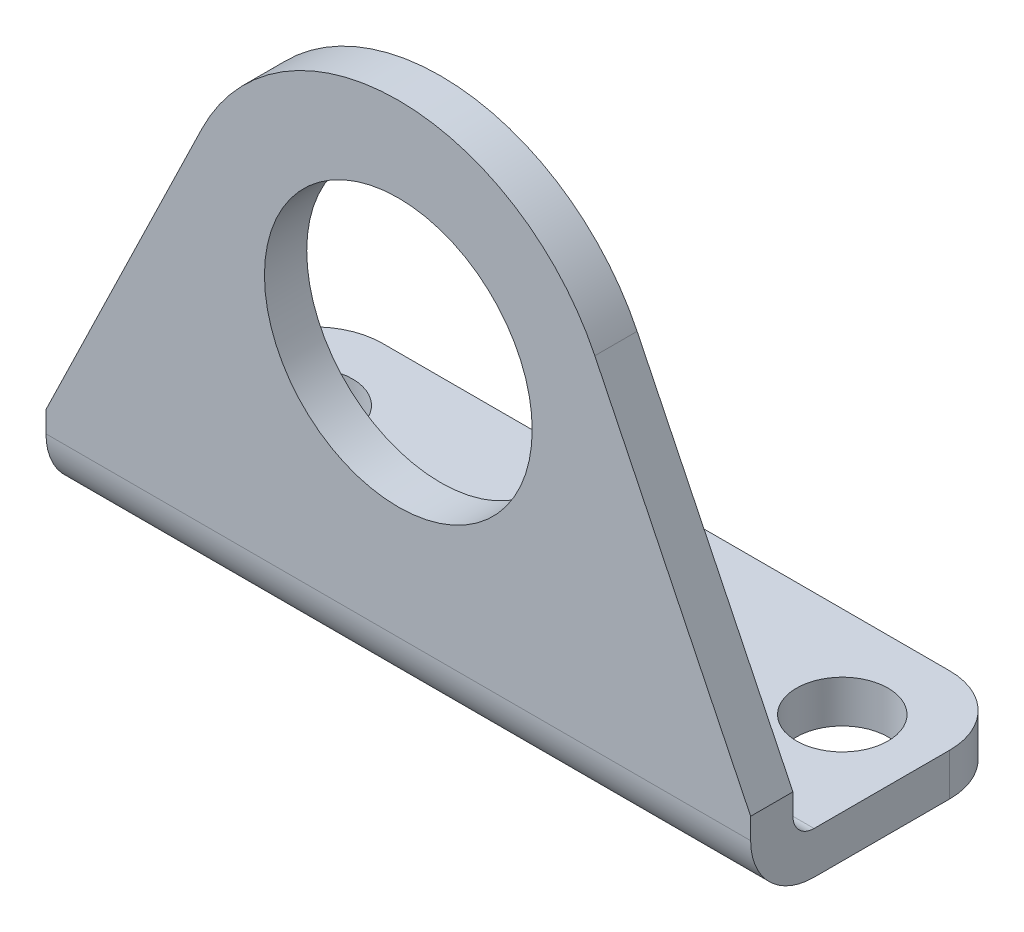
ISO-10303-21;
HEADER;
FILE_DESCRIPTION(('STEP AP214'),'2;1');
FILE_NAME('part.step','',(''),(''),'','','');
FILE_SCHEMA(('AUTOMOTIVE_DESIGN { 1 0 10303 214 1 1 1 1 }'));
ENDSEC;
DATA;
#1=APPLICATION_CONTEXT('core data for automotive mechanical design processes');
#2=APPLICATION_PROTOCOL_DEFINITION('international standard','automotive_design',2000,#1);
#3=PRODUCT_CONTEXT('',#1,'mechanical');
#4=PRODUCT('Part','Part','',(#3));
#5=PRODUCT_RELATED_PRODUCT_CATEGORY('part','',(#4));
#6=PRODUCT_DEFINITION_FORMATION('','',#4);
#7=PRODUCT_DEFINITION_CONTEXT('part definition',#1,'design');
#8=PRODUCT_DEFINITION('design','',#6,#7);
#9=PRODUCT_DEFINITION_SHAPE('','',#8);
#10=(LENGTH_UNIT() NAMED_UNIT(*) SI_UNIT(.MILLI.,.METRE.));
#11=(NAMED_UNIT(*) PLANE_ANGLE_UNIT() SI_UNIT($,.RADIAN.));
#12=(NAMED_UNIT(*) SI_UNIT($,.STERADIAN.) SOLID_ANGLE_UNIT());
#13=UNCERTAINTY_MEASURE_WITH_UNIT(LENGTH_MEASURE(1.E-05),#10,'distance_accuracy_value','');
#14=(GEOMETRIC_REPRESENTATION_CONTEXT(3) GLOBAL_UNCERTAINTY_ASSIGNED_CONTEXT((#13)) GLOBAL_UNIT_ASSIGNED_CONTEXT((#10,
#11,#12)) REPRESENTATION_CONTEXT('',''));
#15=CARTESIAN_POINT('',(0.,0.,0.));
#16=DIRECTION('',(0.,0.,1.));
#17=DIRECTION('',(1.,0.,0.));
#18=AXIS2_PLACEMENT_3D('',#15,#16,#17);
#19=CARTESIAN_POINT('',(-12.7,0.,6.35));
#20=DIRECTION('',(0.,1.,0.));
#21=DIRECTION('',(0.,0.,1.));
#22=AXIS2_PLACEMENT_3D('',#19,#20,#21);
#23=PLANE('',#22);
#24=CARTESIAN_POINT('',(-9.652,0.,0.));
#25=DIRECTION('',(0.,1.,0.));
#26=DIRECTION('',(0.,0.,1.));
#27=AXIS2_PLACEMENT_3D('',#24,#25,#26);
#28=CIRCLE('',#27,1.651);
#29=CARTESIAN_POINT('',(-9.652,0.,1.651));
#30=VERTEX_POINT('',#29);
#31=EDGE_CURVE('E223',#30,#30,#28,.T.);
#32=ORIENTED_EDGE('',*,*,#31,.T.);
#33=EDGE_LOOP('',(#32));
#34=FACE_BOUND('',#33,.T.);
#35=CARTESIAN_POINT('',(9.652,0.,0.));
#36=DIRECTION('',(0.,1.,0.));
#37=DIRECTION('',(0.,0.,1.));
#38=AXIS2_PLACEMENT_3D('',#35,#36,#37);
#39=CIRCLE('',#38,1.65099999999999);
#40=CARTESIAN_POINT('',(9.652,0.,1.65099999999999));
#41=VERTEX_POINT('',#40);
#42=EDGE_CURVE('E219',#41,#41,#39,.T.);
#43=ORIENTED_EDGE('',*,*,#42,.T.);
#44=EDGE_LOOP('',(#43));
#45=FACE_BOUND('',#44,.T.);
#46=DIRECTION('',(0.,0.,-1.));
#47=VECTOR('',#46,1.);
#48=CARTESIAN_POINT('',(-12.7,0.,6.35));
#49=LINE('',#48,#47);
#50=CARTESIAN_POINT('',(-12.7,0.,4.064));
#51=VERTEX_POINT('',#50);
#52=CARTESIAN_POINT('',(-12.7,0.,-0.8255));
#53=VERTEX_POINT('',#52);
#54=EDGE_CURVE('E173',#51,#53,#49,.T.);
#55=ORIENTED_EDGE('',*,*,#54,.T.);
#56=CARTESIAN_POINT('',(-10.2235,0.,-0.8255));
#57=DIRECTION('',(0.,1.,0.));
#58=DIRECTION('',(0.,0.,1.));
#59=AXIS2_PLACEMENT_3D('',#56,#57,#58);
#60=CIRCLE('',#59,2.4765);
#61=CARTESIAN_POINT('',(-10.2235,0.,-3.302));
#62=VERTEX_POINT('',#61);
#63=EDGE_CURVE('E190',#53,#62,#60,.F.);
#64=ORIENTED_EDGE('',*,*,#63,.T.);
#65=DIRECTION('',(1.,0.,0.));
#66=VECTOR('',#65,1.);
#67=CARTESIAN_POINT('',(-12.7,0.,-3.302));
#68=LINE('',#67,#66);
#69=CARTESIAN_POINT('',(10.2235,0.,-3.302));
#70=VERTEX_POINT('',#69);
#71=EDGE_CURVE('E216',#62,#70,#68,.T.);
#72=ORIENTED_EDGE('',*,*,#71,.T.);
#73=CARTESIAN_POINT('',(10.2235,0.,-0.8255));
#74=DIRECTION('',(0.,1.,0.));
#75=DIRECTION('',(0.,0.,1.));
#76=AXIS2_PLACEMENT_3D('',#73,#74,#75);
#77=CIRCLE('',#76,2.4765);
#78=CARTESIAN_POINT('',(12.7,0.,-0.8255));
#79=VERTEX_POINT('',#78);
#80=EDGE_CURVE('E188',#70,#79,#77,.F.);
#81=ORIENTED_EDGE('',*,*,#80,.T.);
#82=DIRECTION('',(0.,0.,-1.));
#83=VECTOR('',#82,1.);
#84=CARTESIAN_POINT('',(12.7,0.,6.35));
#85=LINE('',#84,#83);
#86=CARTESIAN_POINT('',(12.7,0.,4.064));
#87=VERTEX_POINT('',#86);
#88=EDGE_CURVE('E171',#87,#79,#85,.T.);
#89=ORIENTED_EDGE('',*,*,#88,.F.);
#90=DIRECTION('',(-1.,0.,0.));
#91=VECTOR('',#90,1.);
#92=CARTESIAN_POINT('',(12.7,0.,4.064));
#93=LINE('',#92,#91);
#94=EDGE_CURVE('E130',#87,#51,#93,.T.);
#95=ORIENTED_EDGE('',*,*,#94,.T.);
#96=EDGE_LOOP('',(#55,#64,#72,#81,#89,#95));
#97=FACE_BOUND('',#96,.T.);
#98=ADVANCED_FACE('F34',(#34,#45,#97),#23,.F.);
#99=CARTESIAN_POINT('',(0.,11.176,6.35));
#100=DIRECTION('',(0.,0.,1.));
#101=DIRECTION('',(1.,0.,0.));
#102=AXIS2_PLACEMENT_3D('',#99,#100,#101);
#103=PLANE('',#102);
#104=CARTESIAN_POINT('',(0.,11.176,6.35));
#105=DIRECTION('',(0.,0.,1.));
#106=DIRECTION('',(1.,0.,0.));
#107=AXIS2_PLACEMENT_3D('',#104,#105,#106);
#108=CIRCLE('',#107,4.826);
#109=CARTESIAN_POINT('',(4.826,11.176,6.35));
#110=VERTEX_POINT('',#109);
#111=EDGE_CURVE('E154',#110,#110,#108,.T.);
#112=ORIENTED_EDGE('',*,*,#111,.F.);
#113=EDGE_LOOP('',(#112));
#114=FACE_BOUND('',#113,.T.);
#115=DIRECTION('',(0.,-1.,0.));
#116=VECTOR('',#115,1.);
#117=CARTESIAN_POINT('',(-12.7,3.048,6.35));
#118=LINE('',#117,#116);
#119=CARTESIAN_POINT('',(-12.7,3.048,6.35));
#120=VERTEX_POINT('',#119);
#121=CARTESIAN_POINT('',(-12.7,2.286,6.35));
#122=VERTEX_POINT('',#121);
#123=EDGE_CURVE('E143',#120,#122,#118,.T.);
#124=ORIENTED_EDGE('',*,*,#123,.T.);
#125=DIRECTION('',(-1.,0.,0.));
#126=VECTOR('',#125,1.);
#127=CARTESIAN_POINT('',(12.7,2.286,6.35));
#128=LINE('',#127,#126);
#129=CARTESIAN_POINT('',(12.7,2.286,6.35));
#130=VERTEX_POINT('',#129);
#131=EDGE_CURVE('E127',#130,#122,#128,.T.);
#132=ORIENTED_EDGE('',*,*,#131,.F.);
#133=DIRECTION('',(0.,1.,0.));
#134=VECTOR('',#133,1.);
#135=CARTESIAN_POINT('',(12.7,0.,6.35));
#136=LINE('',#135,#134);
#137=CARTESIAN_POINT('',(12.7,3.048,6.35));
#138=VERTEX_POINT('',#137);
#139=EDGE_CURVE('E140',#130,#138,#136,.T.);
#140=ORIENTED_EDGE('',*,*,#139,.T.);
#141=DIRECTION('',(-0.436805905723447,0.899555779663006,0.));
#142=VECTOR('',#141,1.);
#143=CARTESIAN_POINT('',(12.7,3.048,6.35));
#144=LINE('',#143,#142);
#145=CARTESIAN_POINT('',(7.08310220906652,14.6154097016664,6.35));
#146=VERTEX_POINT('',#145);
#147=EDGE_CURVE('E150',#138,#146,#144,.T.);
#148=ORIENTED_EDGE('',*,*,#147,.T.);
#149=CARTESIAN_POINT('',(0.,11.176,6.35));
#150=DIRECTION('',(0.,0.,1.));
#151=DIRECTION('',(1.,0.,0.));
#152=AXIS2_PLACEMENT_3D('',#149,#150,#151);
#153=CIRCLE('',#152,7.87400000000001);
#154=CARTESIAN_POINT('',(-7.08310220906651,14.6154097016664,6.35));
#155=VERTEX_POINT('',#154);
#156=EDGE_CURVE('E152',#146,#155,#153,.T.);
#157=ORIENTED_EDGE('',*,*,#156,.T.);
#158=DIRECTION('',(-0.436805905723447,-0.899555779663006,0.));
#159=VECTOR('',#158,1.);
#160=CARTESIAN_POINT('',(-7.08310220906651,14.6154097016664,6.35));
#161=LINE('',#160,#159);
#162=EDGE_CURVE('E159',#155,#120,#161,.T.);
#163=ORIENTED_EDGE('',*,*,#162,.T.);
#164=EDGE_LOOP('',(#124,#132,#140,#148,#157,#163));
#165=FACE_BOUND('',#164,.T.);
#166=ADVANCED_FACE('F139',(#114,#165),#103,.T.);
#167=CARTESIAN_POINT('',(-7.08310220906651,14.6154097016664,6.35));
#168=DIRECTION('',(0.899555779663006,-0.436805905723447,0.));
#169=DIRECTION('',(0.436805905723447,0.899555779663006,0.));
#170=AXIS2_PLACEMENT_3D('',#167,#168,#169);
#171=PLANE('',#170);
#172=DIRECTION('',(0.,0.,-1.));
#173=VECTOR('',#172,1.);
#174=CARTESIAN_POINT('',(-7.08310220906651,14.6154097016664,6.35));
#175=LINE('',#174,#173);
#176=CARTESIAN_POINT('',(-7.08310220906651,14.6154097016664,4.826));
#177=VERTEX_POINT('',#176);
#178=EDGE_CURVE('E164',#155,#177,#175,.T.);
#179=ORIENTED_EDGE('',*,*,#178,.T.);
#180=DIRECTION('',(-0.436805905723447,-0.899555779663006,0.));
#181=VECTOR('',#180,1.);
#182=CARTESIAN_POINT('',(-7.08310220906651,14.6154097016664,4.826));
#183=LINE('',#182,#181);
#184=CARTESIAN_POINT('',(-12.7,3.048,4.826));
#185=VERTEX_POINT('',#184);
#186=EDGE_CURVE('E228',#177,#185,#183,.T.);
#187=ORIENTED_EDGE('',*,*,#186,.T.);
#188=DIRECTION('',(0.,0.,-1.));
#189=VECTOR('',#188,1.);
#190=CARTESIAN_POINT('',(-12.7,3.048,6.35));
#191=LINE('',#190,#189);
#192=EDGE_CURVE('E161',#120,#185,#191,.T.);
#193=ORIENTED_EDGE('',*,*,#192,.F.);
#194=ORIENTED_EDGE('',*,*,#162,.F.);
#195=EDGE_LOOP('',(#179,#187,#193,#194));
#196=FACE_BOUND('',#195,.T.);
#197=ADVANCED_FACE('F264',(#196),#171,.F.);
#198=CARTESIAN_POINT('',(12.7,3.048,6.35));
#199=DIRECTION('',(-0.899555779663006,-0.436805905723447,0.));
#200=DIRECTION('',(0.436805905723447,-0.899555779663006,0.));
#201=AXIS2_PLACEMENT_3D('',#198,#199,#200);
#202=PLANE('',#201);
#203=DIRECTION('',(0.,0.,-1.));
#204=VECTOR('',#203,1.);
#205=CARTESIAN_POINT('',(12.7,3.048,6.35));
#206=LINE('',#205,#204);
#207=CARTESIAN_POINT('',(12.7,3.048,4.826));
#208=VERTEX_POINT('',#207);
#209=EDGE_CURVE('E148',#138,#208,#206,.T.);
#210=ORIENTED_EDGE('',*,*,#209,.T.);
#211=DIRECTION('',(-0.436805905723447,0.899555779663006,0.));
#212=VECTOR('',#211,1.);
#213=CARTESIAN_POINT('',(12.7,3.048,4.826));
#214=LINE('',#213,#212);
#215=CARTESIAN_POINT('',(7.08310220906652,14.6154097016664,4.826));
#216=VERTEX_POINT('',#215);
#217=EDGE_CURVE('E231',#208,#216,#214,.T.);
#218=ORIENTED_EDGE('',*,*,#217,.T.);
#219=DIRECTION('',(0.,0.,-1.));
#220=VECTOR('',#219,1.);
#221=CARTESIAN_POINT('',(7.08310220906652,14.6154097016664,6.35));
#222=LINE('',#221,#220);
#223=EDGE_CURVE('E167',#146,#216,#222,.T.);
#224=ORIENTED_EDGE('',*,*,#223,.F.);
#225=ORIENTED_EDGE('',*,*,#147,.F.);
#226=EDGE_LOOP('',(#210,#218,#224,#225));
#227=FACE_BOUND('',#226,.T.);
#228=ADVANCED_FACE('F272',(#227),#202,.F.);
#229=CARTESIAN_POINT('',(-12.7,3.048,6.35));
#230=DIRECTION('',(1.,0.,0.));
#231=DIRECTION('',(0.,0.,-1.));
#232=AXIS2_PLACEMENT_3D('',#229,#230,#231);
#233=PLANE('',#232);
#234=DIRECTION('',(0.,0.,1.));
#235=VECTOR('',#234,1.);
#236=CARTESIAN_POINT('',(-12.7,1.524,-3.302));
#237=LINE('',#236,#235);
#238=CARTESIAN_POINT('',(-12.7,1.524,-0.8255));
#239=VERTEX_POINT('',#238);
#240=CARTESIAN_POINT('',(-12.7,1.524,4.064));
#241=VERTEX_POINT('',#240);
#242=EDGE_CURVE('E200',#239,#241,#237,.T.);
#243=ORIENTED_EDGE('',*,*,#242,.F.);
#244=DIRECTION('',(0.,-1.,0.));
#245=VECTOR('',#244,1.);
#246=CARTESIAN_POINT('',(-12.7,3.048,-0.8255));
#247=LINE('',#246,#245);
#248=EDGE_CURVE('E176',#239,#53,#247,.T.);
#249=ORIENTED_EDGE('',*,*,#248,.T.);
#250=ORIENTED_EDGE('',*,*,#54,.F.);
#251=CARTESIAN_POINT('',(-12.7,2.286,4.064));
#252=DIRECTION('',(1.,0.,0.));
#253=DIRECTION('',(0.,0.,1.));
#254=AXIS2_PLACEMENT_3D('',#251,#252,#253);
#255=CIRCLE('',#254,2.286);
#256=EDGE_CURVE('E135',#122,#51,#255,.T.);
#257=ORIENTED_EDGE('',*,*,#256,.F.);
#258=ORIENTED_EDGE('',*,*,#123,.F.);
#259=ORIENTED_EDGE('',*,*,#192,.T.);
#260=DIRECTION('',(0.,1.,0.));
#261=VECTOR('',#260,1.);
#262=CARTESIAN_POINT('',(-12.7,19.05,4.826));
#263=LINE('',#262,#261);
#264=CARTESIAN_POINT('',(-12.7,2.286,4.826));
#265=VERTEX_POINT('',#264);
#266=EDGE_CURVE('E243',#265,#185,#263,.T.);
#267=ORIENTED_EDGE('',*,*,#266,.F.);
#268=CARTESIAN_POINT('',(-12.7,2.286,4.064));
#269=DIRECTION('',(-1.,0.,0.));
#270=DIRECTION('',(0.,0.,1.));
#271=AXIS2_PLACEMENT_3D('',#268,#269,#270);
#272=CIRCLE('',#271,0.762000000000001);
#273=EDGE_CURVE('E211',#241,#265,#272,.T.);
#274=ORIENTED_EDGE('',*,*,#273,.F.);
#275=EDGE_LOOP('',(#243,#249,#250,#257,#258,#259,#267,#274));
#276=FACE_BOUND('',#275,.T.);
#277=ADVANCED_FACE('F207',(#276),#233,.F.);
#278=CARTESIAN_POINT('',(12.7,0.,6.35));
#279=DIRECTION('',(-1.,0.,0.));
#280=DIRECTION('',(0.,0.,1.));
#281=AXIS2_PLACEMENT_3D('',#278,#279,#280);
#282=PLANE('',#281);
#283=ORIENTED_EDGE('',*,*,#88,.T.);
#284=DIRECTION('',(0.,1.,0.));
#285=VECTOR('',#284,1.);
#286=CARTESIAN_POINT('',(12.7,0.,-0.8255));
#287=LINE('',#286,#285);
#288=CARTESIAN_POINT('',(12.7,1.524,-0.8255));
#289=VERTEX_POINT('',#288);
#290=EDGE_CURVE('E11',#79,#289,#287,.T.);
#291=ORIENTED_EDGE('',*,*,#290,.T.);
#292=DIRECTION('',(0.,0.,1.));
#293=VECTOR('',#292,1.);
#294=CARTESIAN_POINT('',(12.7,1.524,-3.302));
#295=LINE('',#294,#293);
#296=CARTESIAN_POINT('',(12.7,1.524,4.064));
#297=VERTEX_POINT('',#296);
#298=EDGE_CURVE('E245',#289,#297,#295,.T.);
#299=ORIENTED_EDGE('',*,*,#298,.T.);
#300=CARTESIAN_POINT('',(12.7,2.286,4.064));
#301=DIRECTION('',(-1.,0.,0.));
#302=DIRECTION('',(0.,0.,1.));
#303=AXIS2_PLACEMENT_3D('',#300,#301,#302);
#304=CIRCLE('',#303,0.762000000000001);
#305=CARTESIAN_POINT('',(12.7,2.286,4.826));
#306=VERTEX_POINT('',#305);
#307=EDGE_CURVE('E248',#297,#306,#304,.T.);
#308=ORIENTED_EDGE('',*,*,#307,.T.);
#309=DIRECTION('',(0.,1.,0.));
#310=VECTOR('',#309,1.);
#311=CARTESIAN_POINT('',(12.7,19.05,4.826));
#312=LINE('',#311,#310);
#313=EDGE_CURVE('E240',#306,#208,#312,.T.);
#314=ORIENTED_EDGE('',*,*,#313,.T.);
#315=ORIENTED_EDGE('',*,*,#209,.F.);
#316=ORIENTED_EDGE('',*,*,#139,.F.);
#317=CARTESIAN_POINT('',(12.7,2.286,4.064));
#318=DIRECTION('',(1.,0.,0.));
#319=DIRECTION('',(0.,0.,1.));
#320=AXIS2_PLACEMENT_3D('',#317,#318,#319);
#321=CIRCLE('',#320,2.286);
#322=EDGE_CURVE('E124',#130,#87,#321,.T.);
#323=ORIENTED_EDGE('',*,*,#322,.T.);
#324=EDGE_LOOP('',(#283,#291,#299,#308,#314,#315,#316,#323));
#325=FACE_BOUND('',#324,.T.);
#326=ADVANCED_FACE('F145',(#325),#282,.F.);
#327=CARTESIAN_POINT('',(0.,11.176,6.35));
#328=DIRECTION('',(0.,0.,-1.));
#329=DIRECTION('',(-1.,0.,0.));
#330=AXIS2_PLACEMENT_3D('',#327,#328,#329);
#331=CYLINDRICAL_SURFACE('',#330,7.87400000000001);
#332=ORIENTED_EDGE('',*,*,#223,.T.);
#333=CARTESIAN_POINT('',(0.,11.176,4.826));
#334=DIRECTION('',(0.,0.,1.));
#335=DIRECTION('',(0.,-1.,0.));
#336=AXIS2_PLACEMENT_3D('',#333,#334,#335);
#337=CIRCLE('',#336,7.87400000000001);
#338=EDGE_CURVE('E185',#216,#177,#337,.T.);
#339=ORIENTED_EDGE('',*,*,#338,.T.);
#340=ORIENTED_EDGE('',*,*,#178,.F.);
#341=ORIENTED_EDGE('',*,*,#156,.F.);
#342=EDGE_LOOP('',(#332,#339,#340,#341));
#343=FACE_BOUND('',#342,.T.);
#344=ADVANCED_FACE('F277',(#343),#331,.T.);
#345=CARTESIAN_POINT('',(0.,11.176,6.35));
#346=DIRECTION('',(0.,0.,-1.));
#347=DIRECTION('',(-1.,0.,0.));
#348=AXIS2_PLACEMENT_3D('',#345,#346,#347);
#349=CYLINDRICAL_SURFACE('',#348,4.826);
#350=CARTESIAN_POINT('',(0.,11.176,4.826));
#351=DIRECTION('',(0.,0.,1.));
#352=DIRECTION('',(0.,-1.,0.));
#353=AXIS2_PLACEMENT_3D('',#350,#351,#352);
#354=CIRCLE('',#353,4.826);
#355=CARTESIAN_POINT('',(0.,6.35,4.826));
#356=VERTEX_POINT('',#355);
#357=EDGE_CURVE('E182',#356,#356,#354,.T.);
#358=ORIENTED_EDGE('',*,*,#357,.F.);
#359=EDGE_LOOP('',(#358));
#360=FACE_BOUND('',#359,.T.);
#361=ORIENTED_EDGE('',*,*,#111,.T.);
#362=EDGE_LOOP('',(#361));
#363=FACE_BOUND('',#362,.T.);
#364=ADVANCED_FACE('F286',(#360,#363),#349,.F.);
#365=CARTESIAN_POINT('',(0.,11.176,-3.302));
#366=DIRECTION('',(0.,0.,1.));
#367=DIRECTION('',(1.,0.,0.));
#368=AXIS2_PLACEMENT_3D('',#365,#366,#367);
#369=PLANE('',#368);
#370=ORIENTED_EDGE('',*,*,#71,.F.);
#371=DIRECTION('',(0.,-1.,0.));
#372=VECTOR('',#371,1.);
#373=CARTESIAN_POINT('',(-10.2235,11.176,-3.302));
#374=LINE('',#373,#372);
#375=CARTESIAN_POINT('',(-10.2235,1.524,-3.302));
#376=VERTEX_POINT('',#375);
#377=EDGE_CURVE('E56',#62,#376,#374,.F.);
#378=ORIENTED_EDGE('',*,*,#377,.T.);
#379=DIRECTION('',(-1.,0.,0.));
#380=VECTOR('',#379,1.);
#381=CARTESIAN_POINT('',(12.7,1.524,-3.302));
#382=LINE('',#381,#380);
#383=CARTESIAN_POINT('',(10.2235,1.524,-3.302));
#384=VERTEX_POINT('',#383);
#385=EDGE_CURVE('E202',#384,#376,#382,.T.);
#386=ORIENTED_EDGE('',*,*,#385,.F.);
#387=DIRECTION('',(0.,1.,0.));
#388=VECTOR('',#387,1.);
#389=CARTESIAN_POINT('',(10.2235,11.176,-3.302));
#390=LINE('',#389,#388);
#391=EDGE_CURVE('E192',#384,#70,#390,.F.);
#392=ORIENTED_EDGE('',*,*,#391,.T.);
#393=EDGE_LOOP('',(#370,#378,#386,#392));
#394=FACE_BOUND('',#393,.T.);
#395=ADVANCED_FACE('F218',(#394),#369,.F.);
#396=CARTESIAN_POINT('',(9.652,19.05,0.));
#397=DIRECTION('',(0.,-1.,0.));
#398=DIRECTION('',(0.,0.,-1.));
#399=AXIS2_PLACEMENT_3D('',#396,#397,#398);
#400=CYLINDRICAL_SURFACE('',#399,1.65099999999999);
#401=CARTESIAN_POINT('',(9.652,1.524,0.));
#402=DIRECTION('',(0.,-1.,0.));
#403=DIRECTION('',(0.,0.,-1.));
#404=AXIS2_PLACEMENT_3D('',#401,#402,#403);
#405=CIRCLE('',#404,1.65099999999999);
#406=CARTESIAN_POINT('',(9.652,1.524,-1.65099999999999));
#407=VERTEX_POINT('',#406);
#408=EDGE_CURVE('E180',#407,#407,#405,.T.);
#409=ORIENTED_EDGE('',*,*,#408,.F.);
#410=EDGE_LOOP('',(#409));
#411=FACE_BOUND('',#410,.T.);
#412=ORIENTED_EDGE('',*,*,#42,.F.);
#413=EDGE_LOOP('',(#412));
#414=FACE_BOUND('',#413,.T.);
#415=ADVANCED_FACE('F294',(#411,#414),#400,.F.);
#416=CARTESIAN_POINT('',(-9.652,19.05,0.));
#417=DIRECTION('',(0.,-1.,0.));
#418=DIRECTION('',(0.,0.,-1.));
#419=AXIS2_PLACEMENT_3D('',#416,#417,#418);
#420=CYLINDRICAL_SURFACE('',#419,1.651);
#421=CARTESIAN_POINT('',(-9.652,1.524,0.));
#422=DIRECTION('',(0.,-1.,0.));
#423=DIRECTION('',(0.,0.,-1.));
#424=AXIS2_PLACEMENT_3D('',#421,#422,#423);
#425=CIRCLE('',#424,1.651);
#426=CARTESIAN_POINT('',(-9.652,1.524,-1.651));
#427=VERTEX_POINT('',#426);
#428=EDGE_CURVE('E177',#427,#427,#425,.T.);
#429=ORIENTED_EDGE('',*,*,#428,.F.);
#430=EDGE_LOOP('',(#429));
#431=FACE_BOUND('',#430,.T.);
#432=ORIENTED_EDGE('',*,*,#31,.F.);
#433=EDGE_LOOP('',(#432));
#434=FACE_BOUND('',#433,.T.);
#435=ADVANCED_FACE('F297',(#431,#434),#420,.F.);
#436=CARTESIAN_POINT('',(12.7,19.05,4.826));
#437=DIRECTION('',(0.,0.,1.));
#438=DIRECTION('',(0.,-1.,0.));
#439=AXIS2_PLACEMENT_3D('',#436,#437,#438);
#440=PLANE('',#439);
#441=ORIENTED_EDGE('',*,*,#357,.T.);
#442=EDGE_LOOP('',(#441));
#443=FACE_BOUND('',#442,.T.);
#444=ORIENTED_EDGE('',*,*,#338,.F.);
#445=ORIENTED_EDGE('',*,*,#217,.F.);
#446=ORIENTED_EDGE('',*,*,#313,.F.);
#447=DIRECTION('',(-1.,0.,0.));
#448=VECTOR('',#447,1.);
#449=CARTESIAN_POINT('',(12.7,2.286,4.826));
#450=LINE('',#449,#448);
#451=EDGE_CURVE('E181',#306,#265,#450,.T.);
#452=ORIENTED_EDGE('',*,*,#451,.T.);
#453=ORIENTED_EDGE('',*,*,#266,.T.);
#454=ORIENTED_EDGE('',*,*,#186,.F.);
#455=EDGE_LOOP('',(#444,#445,#446,#452,#453,#454));
#456=FACE_BOUND('',#455,.T.);
#457=ADVANCED_FACE('F301',(#443,#456),#440,.F.);
#458=CARTESIAN_POINT('',(12.7,2.286,4.064));
#459=DIRECTION('',(-1.,0.,0.));
#460=DIRECTION('',(0.,0.,1.));
#461=AXIS2_PLACEMENT_3D('',#458,#459,#460);
#462=CYLINDRICAL_SURFACE('',#461,0.762000000000001);
#463=ORIENTED_EDGE('',*,*,#273,.T.);
#464=ORIENTED_EDGE('',*,*,#451,.F.);
#465=ORIENTED_EDGE('',*,*,#307,.F.);
#466=DIRECTION('',(-1.,0.,0.));
#467=VECTOR('',#466,1.);
#468=CARTESIAN_POINT('',(12.7,1.524,4.064));
#469=LINE('',#468,#467);
#470=EDGE_CURVE('E239',#297,#241,#469,.T.);
#471=ORIENTED_EDGE('',*,*,#470,.T.);
#472=EDGE_LOOP('',(#463,#464,#465,#471));
#473=FACE_BOUND('',#472,.T.);
#474=ADVANCED_FACE('F305',(#473),#462,.F.);
#475=CARTESIAN_POINT('',(12.7,1.524,-3.302));
#476=DIRECTION('',(0.,-1.,0.));
#477=DIRECTION('',(0.,0.,-1.));
#478=AXIS2_PLACEMENT_3D('',#475,#476,#477);
#479=PLANE('',#478);
#480=ORIENTED_EDGE('',*,*,#408,.T.);
#481=EDGE_LOOP('',(#480));
#482=FACE_BOUND('',#481,.T.);
#483=ORIENTED_EDGE('',*,*,#428,.T.);
#484=EDGE_LOOP('',(#483));
#485=FACE_BOUND('',#484,.T.);
#486=ORIENTED_EDGE('',*,*,#385,.T.);
#487=CARTESIAN_POINT('',(-10.2235,1.524,-0.8255));
#488=DIRECTION('',(0.,-1.,0.));
#489=DIRECTION('',(0.,0.,-1.));
#490=AXIS2_PLACEMENT_3D('',#487,#488,#489);
#491=CIRCLE('',#490,2.4765);
#492=EDGE_CURVE('E42',#376,#239,#491,.F.);
#493=ORIENTED_EDGE('',*,*,#492,.T.);
#494=ORIENTED_EDGE('',*,*,#242,.T.);
#495=ORIENTED_EDGE('',*,*,#470,.F.);
#496=ORIENTED_EDGE('',*,*,#298,.F.);
#497=CARTESIAN_POINT('',(10.2235,1.524,-0.8255));
#498=DIRECTION('',(0.,-1.,0.));
#499=DIRECTION('',(0.,0.,-1.));
#500=AXIS2_PLACEMENT_3D('',#497,#498,#499);
#501=CIRCLE('',#500,2.4765);
#502=EDGE_CURVE('E49',#289,#384,#501,.F.);
#503=ORIENTED_EDGE('',*,*,#502,.T.);
#504=EDGE_LOOP('',(#486,#493,#494,#495,#496,#503));
#505=FACE_BOUND('',#504,.T.);
#506=ADVANCED_FACE('F198',(#482,#485,#505),#479,.F.);
#507=CARTESIAN_POINT('',(12.7,2.286,4.064));
#508=DIRECTION('',(-1.,0.,0.));
#509=DIRECTION('',(0.,0.,1.));
#510=AXIS2_PLACEMENT_3D('',#507,#508,#509);
#511=CYLINDRICAL_SURFACE('',#510,2.286);
#512=ORIENTED_EDGE('',*,*,#256,.T.);
#513=ORIENTED_EDGE('',*,*,#94,.F.);
#514=ORIENTED_EDGE('',*,*,#322,.F.);
#515=ORIENTED_EDGE('',*,*,#131,.T.);
#516=EDGE_LOOP('',(#512,#513,#514,#515));
#517=FACE_BOUND('',#516,.T.);
#518=ADVANCED_FACE('F126',(#517),#511,.T.);
#519=CARTESIAN_POINT('',(-10.2235,3.048,-0.8255));
#520=DIRECTION('',(0.,-1.,0.));
#521=DIRECTION('',(0.,0.,-1.));
#522=AXIS2_PLACEMENT_3D('',#519,#520,#521);
#523=CYLINDRICAL_SURFACE('',#522,2.4765);
#524=ORIENTED_EDGE('',*,*,#492,.F.);
#525=ORIENTED_EDGE('',*,*,#377,.F.);
#526=ORIENTED_EDGE('',*,*,#63,.F.);
#527=ORIENTED_EDGE('',*,*,#248,.F.);
#528=EDGE_LOOP('',(#524,#525,#526,#527));
#529=FACE_BOUND('',#528,.T.);
#530=ADVANCED_FACE('F213',(#529),#523,.T.);
#531=CARTESIAN_POINT('',(10.2235,0.,-0.8255));
#532=DIRECTION('',(0.,1.,0.));
#533=DIRECTION('',(0.,0.,1.));
#534=AXIS2_PLACEMENT_3D('',#531,#532,#533);
#535=CYLINDRICAL_SURFACE('',#534,2.4765);
#536=ORIENTED_EDGE('',*,*,#80,.F.);
#537=ORIENTED_EDGE('',*,*,#391,.F.);
#538=ORIENTED_EDGE('',*,*,#502,.F.);
#539=ORIENTED_EDGE('',*,*,#290,.F.);
#540=EDGE_LOOP('',(#536,#537,#538,#539));
#541=FACE_BOUND('',#540,.T.);
#542=ADVANCED_FACE('F36',(#541),#535,.T.);
#543=CLOSED_SHELL('',(#98,#166,#197,#228,#277,#326,#344,#364,#395,#415,#435,#457,#474,#506,#518,
#530,#542));
#544=MANIFOLD_SOLID_BREP('B2',#543);
#545=ADVANCED_BREP_SHAPE_REPRESENTATION('',(#18,#544),#14);
#546=SHAPE_DEFINITION_REPRESENTATION(#9,#545);
ENDSEC;
END-ISO-10303-21;
